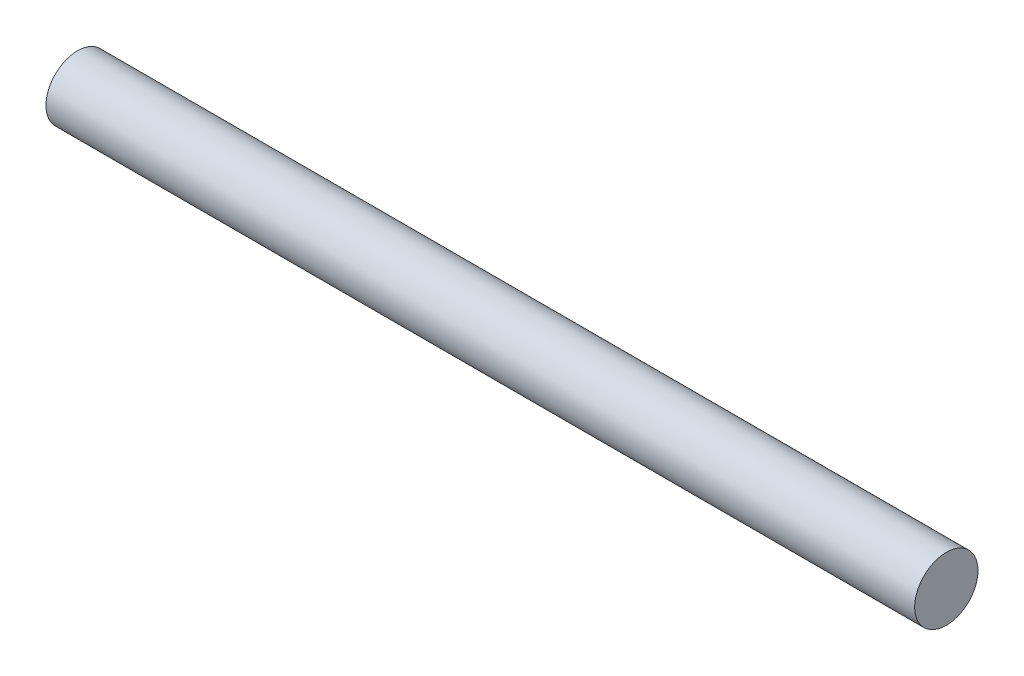
ISO-10303-21;
HEADER;
FILE_DESCRIPTION(('STEP AP214'),'2;1');
FILE_NAME('part.step','',(''),(''),'','','');
FILE_SCHEMA(('AUTOMOTIVE_DESIGN { 1 0 10303 214 1 1 1 1 }'));
ENDSEC;
DATA;
#1=APPLICATION_CONTEXT('core data for automotive mechanical design processes');
#2=APPLICATION_PROTOCOL_DEFINITION('international standard','automotive_design',2000,#1);
#3=PRODUCT_CONTEXT('',#1,'mechanical');
#4=PRODUCT('Part','Part','',(#3));
#5=PRODUCT_RELATED_PRODUCT_CATEGORY('part','',(#4));
#6=PRODUCT_DEFINITION_FORMATION('','',#4);
#7=PRODUCT_DEFINITION_CONTEXT('part definition',#1,'design');
#8=PRODUCT_DEFINITION('design','',#6,#7);
#9=PRODUCT_DEFINITION_SHAPE('','',#8);
#10=(LENGTH_UNIT() NAMED_UNIT(*) SI_UNIT(.MILLI.,.METRE.));
#11=(NAMED_UNIT(*) PLANE_ANGLE_UNIT() SI_UNIT($,.RADIAN.));
#12=(NAMED_UNIT(*) SI_UNIT($,.STERADIAN.) SOLID_ANGLE_UNIT());
#13=UNCERTAINTY_MEASURE_WITH_UNIT(LENGTH_MEASURE(1.E-05),#10,'distance_accuracy_value','');
#14=(GEOMETRIC_REPRESENTATION_CONTEXT(3) GLOBAL_UNCERTAINTY_ASSIGNED_CONTEXT((#13)) GLOBAL_UNIT_ASSIGNED_CONTEXT((#10,
#11,#12)) REPRESENTATION_CONTEXT('',''));
#15=CARTESIAN_POINT('',(0.,0.,0.));
#16=DIRECTION('',(0.,0.,1.));
#17=DIRECTION('',(1.,0.,0.));
#18=AXIS2_PLACEMENT_3D('',#15,#16,#17);
#19=CARTESIAN_POINT('',(24.,0.,0.));
#20=DIRECTION('',(-1.,0.,0.));
#21=DIRECTION('',(0.,0.,1.));
#22=AXIS2_PLACEMENT_3D('',#19,#20,#21);
#23=CYLINDRICAL_SURFACE('',#22,0.875);
#24=CARTESIAN_POINT('',(24.,0.,0.));
#25=DIRECTION('',(1.,0.,0.));
#26=DIRECTION('',(0.,0.,-1.));
#27=AXIS2_PLACEMENT_3D('',#24,#25,#26);
#28=CIRCLE('',#27,0.875);
#29=CARTESIAN_POINT('',(24.,0.,-0.875));
#30=VERTEX_POINT('',#29);
#31=EDGE_CURVE('E10',#30,#30,#28,.T.);
#32=ORIENTED_EDGE('',*,*,#31,.F.);
#33=EDGE_LOOP('',(#32));
#34=FACE_BOUND('',#33,.T.);
#35=CARTESIAN_POINT('',(0.,0.,0.));
#36=DIRECTION('',(1.,0.,0.));
#37=DIRECTION('',(0.,0.,-1.));
#38=AXIS2_PLACEMENT_3D('',#35,#36,#37);
#39=CIRCLE('',#38,0.875);
#40=CARTESIAN_POINT('',(0.,0.,-0.875));
#41=VERTEX_POINT('',#40);
#42=EDGE_CURVE('E46',#41,#41,#39,.T.);
#43=ORIENTED_EDGE('',*,*,#42,.T.);
#44=EDGE_LOOP('',(#43));
#45=FACE_BOUND('',#44,.T.);
#46=ADVANCED_FACE('F43',(#34,#45),#23,.T.);
#47=CARTESIAN_POINT('',(24.,0.,0.));
#48=DIRECTION('',(1.,0.,0.));
#49=DIRECTION('',(0.,0.,-1.));
#50=AXIS2_PLACEMENT_3D('',#47,#48,#49);
#51=PLANE('',#50);
#52=ORIENTED_EDGE('',*,*,#31,.T.);
#53=EDGE_LOOP('',(#52));
#54=FACE_BOUND('',#53,.T.);
#55=ADVANCED_FACE('F60',(#54),#51,.T.);
#56=CARTESIAN_POINT('',(0.,0.,0.));
#57=DIRECTION('',(1.,0.,0.));
#58=DIRECTION('',(0.,0.,-1.));
#59=AXIS2_PLACEMENT_3D('',#56,#57,#58);
#60=PLANE('',#59);
#61=ORIENTED_EDGE('',*,*,#42,.F.);
#62=EDGE_LOOP('',(#61));
#63=FACE_BOUND('',#62,.T.);
#64=ADVANCED_FACE('F58',(#63),#60,.F.);
#65=CLOSED_SHELL('',(#46,#55,#64));
#66=MANIFOLD_SOLID_BREP('B2',#65);
#67=ADVANCED_BREP_SHAPE_REPRESENTATION('',(#18,#66),#14);
#68=SHAPE_DEFINITION_REPRESENTATION(#9,#67);
ENDSEC;
END-ISO-10303-21;
